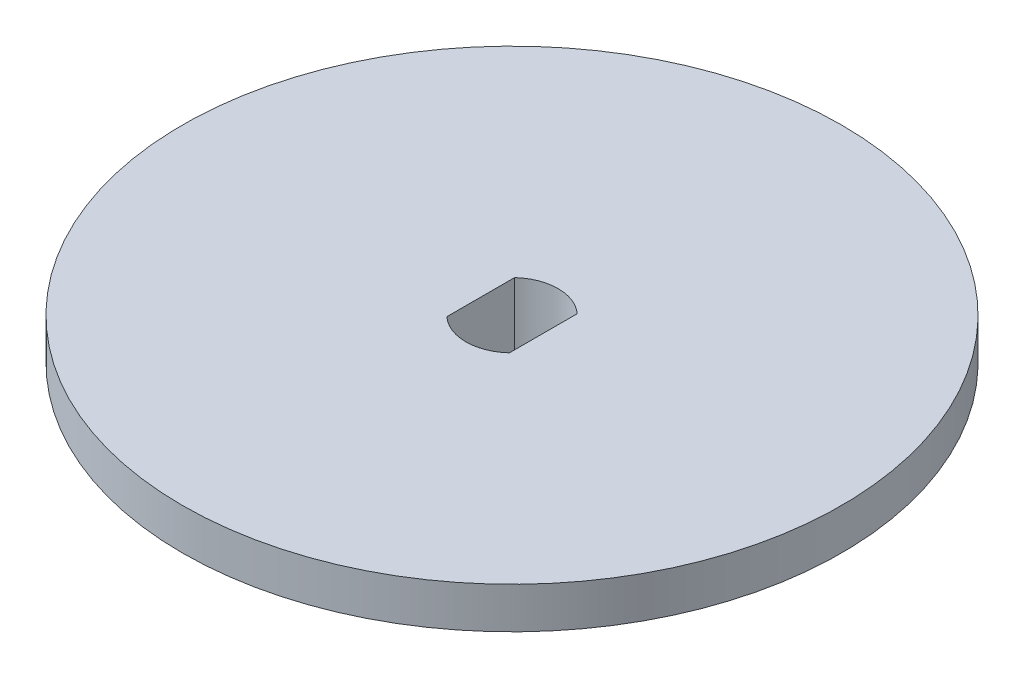
ISO-10303-21;
HEADER;
FILE_DESCRIPTION(('STEP AP214'),'2;1');
FILE_NAME('part.step','',(''),(''),'','','');
FILE_SCHEMA(('AUTOMOTIVE_DESIGN { 1 0 10303 214 1 1 1 1 }'));
ENDSEC;
DATA;
#1=APPLICATION_CONTEXT('core data for automotive mechanical design processes');
#2=APPLICATION_PROTOCOL_DEFINITION('international standard','automotive_design',2000,#1);
#3=PRODUCT_CONTEXT('',#1,'mechanical');
#4=PRODUCT('Part','Part','',(#3));
#5=PRODUCT_RELATED_PRODUCT_CATEGORY('part','',(#4));
#6=PRODUCT_DEFINITION_FORMATION('','',#4);
#7=PRODUCT_DEFINITION_CONTEXT('part definition',#1,'design');
#8=PRODUCT_DEFINITION('design','',#6,#7);
#9=PRODUCT_DEFINITION_SHAPE('','',#8);
#10=(LENGTH_UNIT() NAMED_UNIT(*) SI_UNIT(.MILLI.,.METRE.));
#11=(NAMED_UNIT(*) PLANE_ANGLE_UNIT() SI_UNIT($,.RADIAN.));
#12=(NAMED_UNIT(*) SI_UNIT($,.STERADIAN.) SOLID_ANGLE_UNIT());
#13=UNCERTAINTY_MEASURE_WITH_UNIT(LENGTH_MEASURE(1.E-05),#10,'distance_accuracy_value','');
#14=(GEOMETRIC_REPRESENTATION_CONTEXT(3) GLOBAL_UNCERTAINTY_ASSIGNED_CONTEXT((#13)) GLOBAL_UNIT_ASSIGNED_CONTEXT((#10,
#11,#12)) REPRESENTATION_CONTEXT('',''));
#15=CARTESIAN_POINT('',(0.,0.,0.));
#16=DIRECTION('',(0.,0.,1.));
#17=DIRECTION('',(1.,0.,0.));
#18=AXIS2_PLACEMENT_3D('',#15,#16,#17);
#19=CARTESIAN_POINT('',(-1.9,5.5,0.));
#20=DIRECTION('',(-1.,0.,0.));
#21=DIRECTION('',(0.,0.,1.));
#22=AXIS2_PLACEMENT_3D('',#19,#20,#21);
#23=PLANE('',#22);
#24=DIRECTION('',(0.,-1.,0.));
#25=VECTOR('',#24,1.);
#26=CARTESIAN_POINT('',(-1.9,5.5,-2.05669638012031));
#27=LINE('',#26,#25);
#28=CARTESIAN_POINT('',(-1.9,5.5,-2.05669638012031));
#29=VERTEX_POINT('',#28);
#30=CARTESIAN_POINT('',(-1.9,0.,-2.05669638012031));
#31=VERTEX_POINT('',#30);
#32=EDGE_CURVE('E57',#29,#31,#27,.T.);
#33=ORIENTED_EDGE('',*,*,#32,.F.);
#34=DIRECTION('',(0.,0.,1.));
#35=VECTOR('',#34,1.);
#36=CARTESIAN_POINT('',(-1.9,5.5,0.));
#37=LINE('',#36,#35);
#38=CARTESIAN_POINT('',(-1.9,5.5,2.05669638012031));
#39=VERTEX_POINT('',#38);
#40=EDGE_CURVE('E90',#29,#39,#37,.T.);
#41=ORIENTED_EDGE('',*,*,#40,.T.);
#42=DIRECTION('',(0.,-1.,0.));
#43=VECTOR('',#42,1.);
#44=CARTESIAN_POINT('',(-1.9,5.5,2.05669638012031));
#45=LINE('',#44,#43);
#46=CARTESIAN_POINT('',(-1.9,0.,2.05669638012031));
#47=VERTEX_POINT('',#46);
#48=EDGE_CURVE('E62',#39,#47,#45,.T.);
#49=ORIENTED_EDGE('',*,*,#48,.T.);
#50=DIRECTION('',(0.,0.,-1.));
#51=VECTOR('',#50,1.);
#52=CARTESIAN_POINT('',(-1.9,0.,0.));
#53=LINE('',#52,#51);
#54=EDGE_CURVE('E122',#47,#31,#53,.T.);
#55=ORIENTED_EDGE('',*,*,#54,.T.);
#56=EDGE_LOOP('',(#33,#41,#49,#55));
#57=FACE_BOUND('',#56,.T.);
#58=ADVANCED_FACE('F41',(#57),#23,.F.);
#59=CARTESIAN_POINT('',(0.,5.5,0.));
#60=DIRECTION('',(0.,-1.,0.));
#61=DIRECTION('',(0.,0.,-1.));
#62=AXIS2_PLACEMENT_3D('',#59,#60,#61);
#63=CYLINDRICAL_SURFACE('',#62,2.8);
#64=DIRECTION('',(0.,-1.,0.));
#65=VECTOR('',#64,1.);
#66=CARTESIAN_POINT('',(1.9,5.5,-2.05669638012031));
#67=LINE('',#66,#65);
#68=CARTESIAN_POINT('',(1.9,5.5,-2.05669638012031));
#69=VERTEX_POINT('',#68);
#70=CARTESIAN_POINT('',(1.9,0.,-2.05669638012031));
#71=VERTEX_POINT('',#70);
#72=EDGE_CURVE('E107',#69,#71,#67,.T.);
#73=ORIENTED_EDGE('',*,*,#72,.F.);
#74=CARTESIAN_POINT('',(0.,5.5,0.));
#75=DIRECTION('',(0.,1.,0.));
#76=DIRECTION('',(0.,0.,1.));
#77=AXIS2_PLACEMENT_3D('',#74,#75,#76);
#78=CIRCLE('',#77,2.8);
#79=EDGE_CURVE('E94',#69,#29,#78,.T.);
#80=ORIENTED_EDGE('',*,*,#79,.T.);
#81=ORIENTED_EDGE('',*,*,#32,.T.);
#82=CARTESIAN_POINT('',(0.,0.,0.));
#83=DIRECTION('',(0.,1.,0.));
#84=DIRECTION('',(0.,0.,1.));
#85=AXIS2_PLACEMENT_3D('',#82,#83,#84);
#86=CIRCLE('',#85,2.8);
#87=EDGE_CURVE('E118',#71,#31,#86,.T.);
#88=ORIENTED_EDGE('',*,*,#87,.F.);
#89=EDGE_LOOP('',(#73,#80,#81,#88));
#90=FACE_BOUND('',#89,.T.);
#91=ADVANCED_FACE('F158',(#90),#63,.F.);
#92=CARTESIAN_POINT('',(1.9,5.5,0.));
#93=DIRECTION('',(1.,0.,0.));
#94=DIRECTION('',(0.,0.,-1.));
#95=AXIS2_PLACEMENT_3D('',#92,#93,#94);
#96=PLANE('',#95);
#97=DIRECTION('',(0.,-1.,0.));
#98=VECTOR('',#97,1.);
#99=CARTESIAN_POINT('',(1.9,5.5,2.05669638012031));
#100=LINE('',#99,#98);
#101=CARTESIAN_POINT('',(1.9,5.5,2.05669638012031));
#102=VERTEX_POINT('',#101);
#103=CARTESIAN_POINT('',(1.9,0.,2.05669638012031));
#104=VERTEX_POINT('',#103);
#105=EDGE_CURVE('E87',#102,#104,#100,.T.);
#106=ORIENTED_EDGE('',*,*,#105,.F.);
#107=DIRECTION('',(0.,0.,-1.));
#108=VECTOR('',#107,1.);
#109=CARTESIAN_POINT('',(1.9,5.5,0.));
#110=LINE('',#109,#108);
#111=EDGE_CURVE('E50',#102,#69,#110,.T.);
#112=ORIENTED_EDGE('',*,*,#111,.T.);
#113=ORIENTED_EDGE('',*,*,#72,.T.);
#114=DIRECTION('',(0.,0.,1.));
#115=VECTOR('',#114,1.);
#116=CARTESIAN_POINT('',(1.9,0.,0.));
#117=LINE('',#116,#115);
#118=EDGE_CURVE('E114',#71,#104,#117,.T.);
#119=ORIENTED_EDGE('',*,*,#118,.T.);
#120=EDGE_LOOP('',(#106,#112,#113,#119));
#121=FACE_BOUND('',#120,.T.);
#122=ADVANCED_FACE('F163',(#121),#96,.F.);
#123=CARTESIAN_POINT('',(0.,5.5,0.));
#124=DIRECTION('',(0.,-1.,0.));
#125=DIRECTION('',(0.,0.,-1.));
#126=AXIS2_PLACEMENT_3D('',#123,#124,#125);
#127=CYLINDRICAL_SURFACE('',#126,5.85);
#128=CARTESIAN_POINT('',(0.,0.,0.));
#129=DIRECTION('',(0.,1.,0.));
#130=DIRECTION('',(0.,0.,1.));
#131=AXIS2_PLACEMENT_3D('',#128,#129,#130);
#132=CIRCLE('',#131,5.85);
#133=CARTESIAN_POINT('',(0.,0.,5.85));
#134=VERTEX_POINT('',#133);
#135=EDGE_CURVE('E125',#134,#134,#132,.T.);
#136=ORIENTED_EDGE('',*,*,#135,.T.);
#137=EDGE_LOOP('',(#136));
#138=FACE_BOUND('',#137,.T.);
#139=CARTESIAN_POINT('',(0.,3.,0.));
#140=DIRECTION('',(0.,1.,0.));
#141=DIRECTION('',(0.,0.,1.));
#142=AXIS2_PLACEMENT_3D('',#139,#140,#141);
#143=CIRCLE('',#142,5.85);
#144=CARTESIAN_POINT('',(0.,3.,5.85));
#145=VERTEX_POINT('',#144);
#146=EDGE_CURVE('E95',#145,#145,#143,.T.);
#147=ORIENTED_EDGE('',*,*,#146,.F.);
#148=EDGE_LOOP('',(#147));
#149=FACE_BOUND('',#148,.T.);
#150=ADVANCED_FACE('F43',(#138,#149),#127,.T.);
#151=CARTESIAN_POINT('',(0.,5.5,0.));
#152=DIRECTION('',(0.,-1.,0.));
#153=DIRECTION('',(0.,0.,-1.));
#154=AXIS2_PLACEMENT_3D('',#151,#152,#153);
#155=CYLINDRICAL_SURFACE('',#154,2.8);
#156=ORIENTED_EDGE('',*,*,#48,.F.);
#157=CARTESIAN_POINT('',(0.,5.5,0.));
#158=DIRECTION('',(0.,1.,0.));
#159=DIRECTION('',(0.,0.,1.));
#160=AXIS2_PLACEMENT_3D('',#157,#158,#159);
#161=CIRCLE('',#160,2.8);
#162=EDGE_CURVE('E11',#39,#102,#161,.T.);
#163=ORIENTED_EDGE('',*,*,#162,.T.);
#164=ORIENTED_EDGE('',*,*,#105,.T.);
#165=CARTESIAN_POINT('',(0.,0.,0.));
#166=DIRECTION('',(0.,1.,0.));
#167=DIRECTION('',(0.,0.,1.));
#168=AXIS2_PLACEMENT_3D('',#165,#166,#167);
#169=CIRCLE('',#168,2.8);
#170=EDGE_CURVE('E85',#47,#104,#169,.T.);
#171=ORIENTED_EDGE('',*,*,#170,.F.);
#172=EDGE_LOOP('',(#156,#163,#164,#171));
#173=FACE_BOUND('',#172,.T.);
#174=ADVANCED_FACE('F81',(#173),#155,.F.);
#175=CARTESIAN_POINT('',(0.,0.,0.));
#176=DIRECTION('',(0.,1.,0.));
#177=DIRECTION('',(0.,0.,1.));
#178=AXIS2_PLACEMENT_3D('',#175,#176,#177);
#179=PLANE('',#178);
#180=ORIENTED_EDGE('',*,*,#135,.F.);
#181=EDGE_LOOP('',(#180));
#182=FACE_BOUND('',#181,.T.);
#183=ORIENTED_EDGE('',*,*,#54,.F.);
#184=ORIENTED_EDGE('',*,*,#170,.T.);
#185=ORIENTED_EDGE('',*,*,#118,.F.);
#186=ORIENTED_EDGE('',*,*,#87,.T.);
#187=EDGE_LOOP('',(#183,#184,#185,#186));
#188=FACE_BOUND('',#187,.T.);
#189=ADVANCED_FACE('F146',(#182,#188),#179,.F.);
#190=CARTESIAN_POINT('',(0.,3.,0.));
#191=DIRECTION('',(0.,1.,0.));
#192=DIRECTION('',(0.,0.,1.));
#193=AXIS2_PLACEMENT_3D('',#190,#191,#192);
#194=PLANE('',#193);
#195=ORIENTED_EDGE('',*,*,#146,.T.);
#196=EDGE_LOOP('',(#195));
#197=FACE_BOUND('',#196,.T.);
#198=CARTESIAN_POINT('',(0.,3.,0.));
#199=DIRECTION('',(0.,1.,0.));
#200=DIRECTION('',(0.,0.,1.));
#201=AXIS2_PLACEMENT_3D('',#198,#199,#200);
#202=CIRCLE('',#201,20.);
#203=CARTESIAN_POINT('',(0.,3.,20.));
#204=VERTEX_POINT('',#203);
#205=EDGE_CURVE('E129',#204,#204,#202,.T.);
#206=ORIENTED_EDGE('',*,*,#205,.F.);
#207=EDGE_LOOP('',(#206));
#208=FACE_BOUND('',#207,.T.);
#209=ADVANCED_FACE('F144',(#197,#208),#194,.F.);
#210=CARTESIAN_POINT('',(0.,3.,0.));
#211=DIRECTION('',(0.,1.,0.));
#212=DIRECTION('',(0.,0.,1.));
#213=AXIS2_PLACEMENT_3D('',#210,#211,#212);
#214=CYLINDRICAL_SURFACE('',#213,20.);
#215=ORIENTED_EDGE('',*,*,#205,.T.);
#216=EDGE_LOOP('',(#215));
#217=FACE_BOUND('',#216,.T.);
#218=CARTESIAN_POINT('',(0.,5.5,0.));
#219=DIRECTION('',(0.,1.,0.));
#220=DIRECTION('',(0.,0.,1.));
#221=AXIS2_PLACEMENT_3D('',#218,#219,#220);
#222=CIRCLE('',#221,20.);
#223=CARTESIAN_POINT('',(0.,5.5,20.));
#224=VERTEX_POINT('',#223);
#225=EDGE_CURVE('E133',#224,#224,#222,.T.);
#226=ORIENTED_EDGE('',*,*,#225,.F.);
#227=EDGE_LOOP('',(#226));
#228=FACE_BOUND('',#227,.T.);
#229=ADVANCED_FACE('F141',(#217,#228),#214,.T.);
#230=CARTESIAN_POINT('',(0.,5.5,0.));
#231=DIRECTION('',(0.,1.,0.));
#232=DIRECTION('',(0.,0.,1.));
#233=AXIS2_PLACEMENT_3D('',#230,#231,#232);
#234=PLANE('',#233);
#235=ORIENTED_EDGE('',*,*,#162,.F.);
#236=ORIENTED_EDGE('',*,*,#40,.F.);
#237=ORIENTED_EDGE('',*,*,#79,.F.);
#238=ORIENTED_EDGE('',*,*,#111,.F.);
#239=EDGE_LOOP('',(#235,#236,#237,#238));
#240=FACE_BOUND('',#239,.T.);
#241=ORIENTED_EDGE('',*,*,#225,.T.);
#242=EDGE_LOOP('',(#241));
#243=FACE_BOUND('',#242,.T.);
#244=ADVANCED_FACE('F97',(#240,#243),#234,.T.);
#245=CLOSED_SHELL('',(#58,#91,#122,#150,#174,#189,#209,#229,#244));
#246=MANIFOLD_SOLID_BREP('B2',#245);
#247=ADVANCED_BREP_SHAPE_REPRESENTATION('',(#18,#246),#14);
#248=SHAPE_DEFINITION_REPRESENTATION(#9,#247);
ENDSEC;
END-ISO-10303-21;
